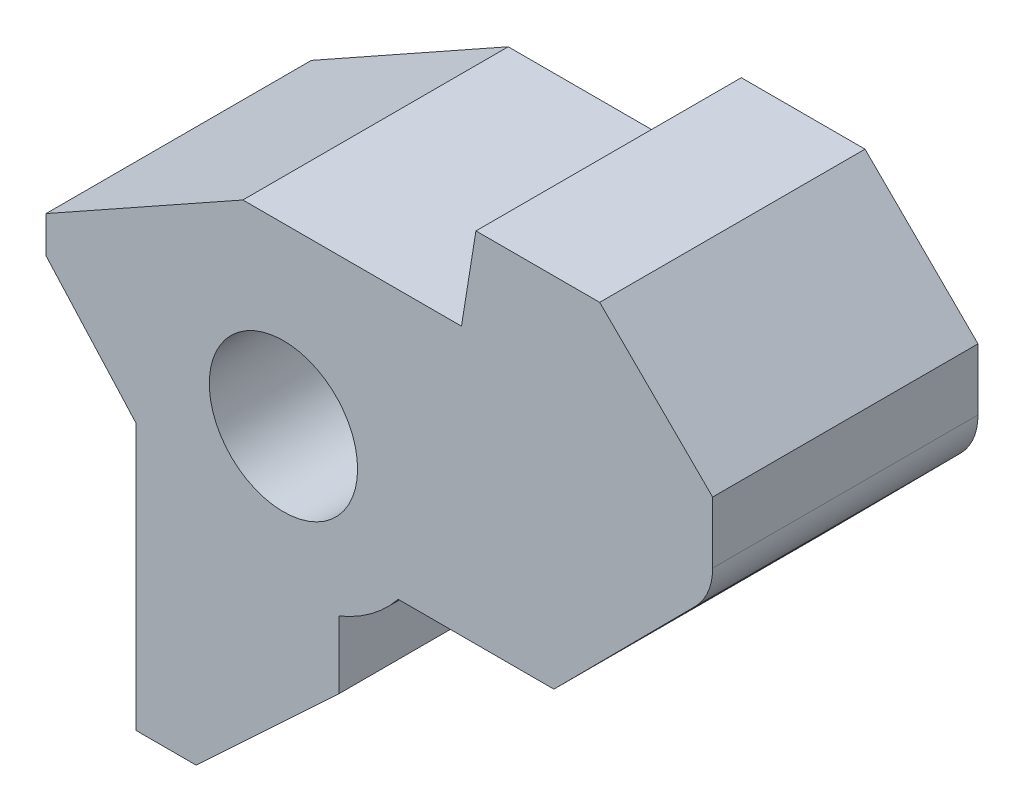
ISO-10303-21;
HEADER;
FILE_DESCRIPTION(('STEP AP214'),'2;1');
FILE_NAME('part.step','',(''),(''),'','','');
FILE_SCHEMA(('AUTOMOTIVE_DESIGN { 1 0 10303 214 1 1 1 1 }'));
ENDSEC;
DATA;
#1=APPLICATION_CONTEXT('core data for automotive mechanical design processes');
#2=APPLICATION_PROTOCOL_DEFINITION('international standard','automotive_design',2000,#1);
#3=PRODUCT_CONTEXT('',#1,'mechanical');
#4=PRODUCT('Part','Part','',(#3));
#5=PRODUCT_RELATED_PRODUCT_CATEGORY('part','',(#4));
#6=PRODUCT_DEFINITION_FORMATION('','',#4);
#7=PRODUCT_DEFINITION_CONTEXT('part definition',#1,'design');
#8=PRODUCT_DEFINITION('design','',#6,#7);
#9=PRODUCT_DEFINITION_SHAPE('','',#8);
#10=(LENGTH_UNIT() NAMED_UNIT(*) SI_UNIT(.MILLI.,.METRE.));
#11=(NAMED_UNIT(*) PLANE_ANGLE_UNIT() SI_UNIT($,.RADIAN.));
#12=(NAMED_UNIT(*) SI_UNIT($,.STERADIAN.) SOLID_ANGLE_UNIT());
#13=UNCERTAINTY_MEASURE_WITH_UNIT(LENGTH_MEASURE(1.E-05),#10,'distance_accuracy_value','');
#14=(GEOMETRIC_REPRESENTATION_CONTEXT(3) GLOBAL_UNCERTAINTY_ASSIGNED_CONTEXT((#13)) GLOBAL_UNIT_ASSIGNED_CONTEXT((#10,
#11,#12)) REPRESENTATION_CONTEXT('',''));
#15=CARTESIAN_POINT('',(0.,0.,0.));
#16=DIRECTION('',(0.,0.,1.));
#17=DIRECTION('',(1.,0.,0.));
#18=AXIS2_PLACEMENT_3D('',#15,#16,#17);
#19=CARTESIAN_POINT('',(1.87605445969652,0.,9.));
#20=DIRECTION('',(1.,0.,0.));
#21=DIRECTION('',(0.,1.,0.));
#22=AXIS2_PLACEMENT_3D('',#19,#20,#21);
#23=PLANE('',#22);
#24=DIRECTION('',(0.,-1.,0.));
#25=VECTOR('',#24,1.);
#26=CARTESIAN_POINT('',(1.87605445969652,0.,0.));
#27=LINE('',#26,#25);
#28=CARTESIAN_POINT('',(1.87605445969652,-4.63469736490451,0.));
#29=VERTEX_POINT('',#28);
#30=CARTESIAN_POINT('',(1.87605445969652,-6.92386785714255,0.));
#31=VERTEX_POINT('',#30);
#32=EDGE_CURVE('E150',#29,#31,#27,.T.);
#33=ORIENTED_EDGE('',*,*,#32,.F.);
#34=DIRECTION('',(0.,0.,-1.));
#35=VECTOR('',#34,1.);
#36=CARTESIAN_POINT('',(1.87605445969652,-4.63469736490451,9.));
#37=LINE('',#36,#35);
#38=CARTESIAN_POINT('',(1.87605445969652,-4.63469736490451,9.));
#39=VERTEX_POINT('',#38);
#40=EDGE_CURVE('E145',#39,#29,#37,.T.);
#41=ORIENTED_EDGE('',*,*,#40,.F.);
#42=DIRECTION('',(0.,-1.,0.));
#43=VECTOR('',#42,1.);
#44=CARTESIAN_POINT('',(1.87605445969652,0.,9.));
#45=LINE('',#44,#43);
#46=CARTESIAN_POINT('',(1.87605445969652,-6.92386785714255,9.));
#47=VERTEX_POINT('',#46);
#48=EDGE_CURVE('E148',#39,#47,#45,.T.);
#49=ORIENTED_EDGE('',*,*,#48,.T.);
#50=DIRECTION('',(0.,0.,-1.));
#51=VECTOR('',#50,1.);
#52=CARTESIAN_POINT('',(1.87605445969652,-6.92386785714255,9.));
#53=LINE('',#52,#51);
#54=EDGE_CURVE('E213',#47,#31,#53,.T.);
#55=ORIENTED_EDGE('',*,*,#54,.T.);
#56=EDGE_LOOP('',(#33,#41,#49,#55));
#57=FACE_BOUND('',#56,.T.);
#58=ADVANCED_FACE('F34',(#57),#23,.T.);
#59=CARTESIAN_POINT('',(0.,0.,9.));
#60=DIRECTION('',(0.,0.,-1.));
#61=DIRECTION('',(-1.,0.,0.));
#62=AXIS2_PLACEMENT_3D('',#59,#60,#61);
#63=CYLINDRICAL_SURFACE('',#62,5.);
#64=CARTESIAN_POINT('',(0.,0.,0.));
#65=DIRECTION('',(0.,0.,1.));
#66=DIRECTION('',(1.,0.,0.));
#67=AXIS2_PLACEMENT_3D('',#64,#65,#66);
#68=CIRCLE('',#67,5.);
#69=CARTESIAN_POINT('',(3.8931956076666,-3.13736003041498,0.));
#70=VERTEX_POINT('',#69);
#71=EDGE_CURVE('E215',#29,#70,#68,.T.);
#72=ORIENTED_EDGE('',*,*,#71,.T.);
#73=DIRECTION('',(0.,0.,-1.));
#74=VECTOR('',#73,1.);
#75=CARTESIAN_POINT('',(3.8931956076666,-3.13736003041498,9.));
#76=LINE('',#75,#74);
#77=CARTESIAN_POINT('',(3.8931956076666,-3.13736003041498,9.));
#78=VERTEX_POINT('',#77);
#79=EDGE_CURVE('E155',#78,#70,#76,.T.);
#80=ORIENTED_EDGE('',*,*,#79,.F.);
#81=CARTESIAN_POINT('',(0.,0.,9.));
#82=DIRECTION('',(0.,0.,1.));
#83=DIRECTION('',(1.,0.,0.));
#84=AXIS2_PLACEMENT_3D('',#81,#82,#83);
#85=CIRCLE('',#84,5.);
#86=EDGE_CURVE('E158',#39,#78,#85,.T.);
#87=ORIENTED_EDGE('',*,*,#86,.F.);
#88=ORIENTED_EDGE('',*,*,#40,.T.);
#89=EDGE_LOOP('',(#72,#80,#87,#88));
#90=FACE_BOUND('',#89,.T.);
#91=ADVANCED_FACE('F159',(#90),#63,.T.);
#92=CARTESIAN_POINT('',(0.,-3.13736003041498,9.));
#93=DIRECTION('',(0.,-1.,0.));
#94=DIRECTION('',(1.,0.,0.));
#95=AXIS2_PLACEMENT_3D('',#92,#93,#94);
#96=PLANE('',#95);
#97=DIRECTION('',(-1.,0.,0.));
#98=VECTOR('',#97,1.);
#99=CARTESIAN_POINT('',(0.,-3.13736003041498,0.));
#100=LINE('',#99,#98);
#101=CARTESIAN_POINT('',(9.17297865889068,-3.13736003041498,0.));
#102=VERTEX_POINT('',#101);
#103=EDGE_CURVE('E217',#102,#70,#100,.T.);
#104=ORIENTED_EDGE('',*,*,#103,.F.);
#105=DIRECTION('',(0.,0.,-1.));
#106=VECTOR('',#105,1.);
#107=CARTESIAN_POINT('',(9.17297865889068,-3.13736003041498,9.));
#108=LINE('',#107,#106);
#109=CARTESIAN_POINT('',(9.17297865889068,-3.13736003041498,9.));
#110=VERTEX_POINT('',#109);
#111=EDGE_CURVE('E274',#110,#102,#108,.T.);
#112=ORIENTED_EDGE('',*,*,#111,.F.);
#113=DIRECTION('',(-1.,0.,0.));
#114=VECTOR('',#113,1.);
#115=CARTESIAN_POINT('',(0.,-3.13736003041498,9.));
#116=LINE('',#115,#114);
#117=EDGE_CURVE('E163',#110,#78,#116,.T.);
#118=ORIENTED_EDGE('',*,*,#117,.T.);
#119=ORIENTED_EDGE('',*,*,#79,.T.);
#120=EDGE_LOOP('',(#104,#112,#118,#119));
#121=FACE_BOUND('',#120,.T.);
#122=ADVANCED_FACE('F304',(#121),#96,.T.);
#123=CARTESIAN_POINT('',(6.18871742745594,-6.14355777107952,9.));
#124=DIRECTION('',(0.709691382805682,-0.704512697665102,0.));
#125=DIRECTION('',(0.704512697665102,0.709691382805682,0.));
#126=AXIS2_PLACEMENT_3D('',#123,#124,#125);
#127=PLANE('',#126);
#128=DIRECTION('',(-0.704512697665102,-0.709691382805682,0.));
#129=VECTOR('',#128,1.);
#130=CARTESIAN_POINT('',(6.18871742745594,-6.14355777107952,0.));
#131=LINE('',#130,#129);
#132=CARTESIAN_POINT('',(13.9764570076674,1.70142740793573,0.));
#133=VERTEX_POINT('',#132);
#134=EDGE_CURVE('E220',#133,#102,#131,.T.);
#135=ORIENTED_EDGE('',*,*,#134,.F.);
#136=DIRECTION('',(0.,0.,-1.));
#137=VECTOR('',#136,1.);
#138=CARTESIAN_POINT('',(13.9764570076674,1.70142740793573,9.));
#139=LINE('',#138,#137);
#140=CARTESIAN_POINT('',(13.9764570076674,1.70142740793573,9.));
#141=VERTEX_POINT('',#140);
#142=EDGE_CURVE('E42',#133,#141,#139,.F.);
#143=ORIENTED_EDGE('',*,*,#142,.T.);
#144=DIRECTION('',(-0.704512697665102,-0.709691382805682,0.));
#145=VECTOR('',#144,1.);
#146=CARTESIAN_POINT('',(6.18871742745594,-6.14355777107952,9.));
#147=LINE('',#146,#145);
#148=EDGE_CURVE('E178',#141,#110,#147,.T.);
#149=ORIENTED_EDGE('',*,*,#148,.T.);
#150=ORIENTED_EDGE('',*,*,#111,.T.);
#151=EDGE_LOOP('',(#135,#143,#149,#150));
#152=FACE_BOUND('',#151,.T.);
#153=ADVANCED_FACE('F309',(#152),#127,.T.);
#154=CARTESIAN_POINT('',(14.557074242056,0.,9.));
#155=DIRECTION('',(1.,0.,0.));
#156=DIRECTION('',(0.,0.,-1.));
#157=AXIS2_PLACEMENT_3D('',#154,#155,#156);
#158=PLANE('',#157);
#159=DIRECTION('',(0.,-1.,0.));
#160=VECTOR('',#159,1.);
#161=CARTESIAN_POINT('',(14.557074242056,0.,9.));
#162=LINE('',#161,#160);
#163=CARTESIAN_POINT('',(14.557074242056,5.19802237614641,9.));
#164=VERTEX_POINT('',#163);
#165=CARTESIAN_POINT('',(14.557074242056,3.11045280326593,9.));
#166=VERTEX_POINT('',#165);
#167=EDGE_CURVE('E180',#164,#166,#162,.T.);
#168=ORIENTED_EDGE('',*,*,#167,.T.);
#169=DIRECTION('',(0.,0.,-1.));
#170=VECTOR('',#169,1.);
#171=CARTESIAN_POINT('',(14.557074242056,3.11045280326593,9.));
#172=LINE('',#171,#170);
#173=CARTESIAN_POINT('',(14.557074242056,3.11045280326593,0.));
#174=VERTEX_POINT('',#173);
#175=EDGE_CURVE('E154',#166,#174,#172,.T.);
#176=ORIENTED_EDGE('',*,*,#175,.T.);
#177=DIRECTION('',(0.,-1.,0.));
#178=VECTOR('',#177,1.);
#179=CARTESIAN_POINT('',(14.557074242056,0.,0.));
#180=LINE('',#179,#178);
#181=CARTESIAN_POINT('',(14.557074242056,5.19802237614641,0.));
#182=VERTEX_POINT('',#181);
#183=EDGE_CURVE('E222',#182,#174,#180,.T.);
#184=ORIENTED_EDGE('',*,*,#183,.F.);
#185=DIRECTION('',(0.,0.,-1.));
#186=VECTOR('',#185,1.);
#187=CARTESIAN_POINT('',(14.557074242056,5.19802237614641,9.));
#188=LINE('',#187,#186);
#189=EDGE_CURVE('E272',#164,#182,#188,.T.);
#190=ORIENTED_EDGE('',*,*,#189,.F.);
#191=EDGE_LOOP('',(#168,#176,#184,#190));
#192=FACE_BOUND('',#191,.T.);
#193=ADVANCED_FACE('F283',(#192),#158,.T.);
#194=CARTESIAN_POINT('',(9.82417265596004,9.89638753174656,9.));
#195=DIRECTION('',(0.704512697665102,0.709691382805682,0.));
#196=DIRECTION('',(-0.709691382805682,0.704512697665102,0.));
#197=AXIS2_PLACEMENT_3D('',#194,#195,#196);
#198=PLANE('',#197);
#199=DIRECTION('',(0.709691382805682,-0.704512697665102,0.));
#200=VECTOR('',#199,1.);
#201=CARTESIAN_POINT('',(9.82417265596004,9.89638753174656,0.));
#202=LINE('',#201,#200);
#203=CARTESIAN_POINT('',(10.7256498043451,9.00148854737192,0.));
#204=VERTEX_POINT('',#203);
#205=EDGE_CURVE('E224',#204,#182,#202,.T.);
#206=ORIENTED_EDGE('',*,*,#205,.F.);
#207=DIRECTION('',(0.,0.,-1.));
#208=VECTOR('',#207,1.);
#209=CARTESIAN_POINT('',(10.7256498043451,9.00148854737192,9.));
#210=LINE('',#209,#208);
#211=CARTESIAN_POINT('',(10.7256498043451,9.00148854737192,9.));
#212=VERTEX_POINT('',#211);
#213=EDGE_CURVE('E270',#212,#204,#210,.T.);
#214=ORIENTED_EDGE('',*,*,#213,.F.);
#215=DIRECTION('',(0.709691382805682,-0.704512697665102,0.));
#216=VECTOR('',#215,1.);
#217=CARTESIAN_POINT('',(9.82417265596004,9.89638753174656,9.));
#218=LINE('',#217,#216);
#219=EDGE_CURVE('E183',#212,#164,#218,.T.);
#220=ORIENTED_EDGE('',*,*,#219,.T.);
#221=ORIENTED_EDGE('',*,*,#189,.T.);
#222=EDGE_LOOP('',(#206,#214,#220,#221));
#223=FACE_BOUND('',#222,.T.);
#224=ADVANCED_FACE('F292',(#223),#198,.T.);
#225=CARTESIAN_POINT('',(0.,9.00148854737192,9.));
#226=DIRECTION('',(0.,1.,0.));
#227=DIRECTION('',(0.,0.,1.));
#228=AXIS2_PLACEMENT_3D('',#225,#226,#227);
#229=PLANE('',#228);
#230=DIRECTION('',(1.,0.,0.));
#231=VECTOR('',#230,1.);
#232=CARTESIAN_POINT('',(0.,9.00148854737192,0.));
#233=LINE('',#232,#231);
#234=CARTESIAN_POINT('',(6.5285930170798,9.00148854737192,0.));
#235=VERTEX_POINT('',#234);
#236=EDGE_CURVE('E227',#235,#204,#233,.T.);
#237=ORIENTED_EDGE('',*,*,#236,.F.);
#238=DIRECTION('',(0.,0.,-1.));
#239=VECTOR('',#238,1.);
#240=CARTESIAN_POINT('',(6.5285930170798,9.00148854737192,9.));
#241=LINE('',#240,#239);
#242=CARTESIAN_POINT('',(6.5285930170798,9.00148854737192,9.));
#243=VERTEX_POINT('',#242);
#244=EDGE_CURVE('E268',#243,#235,#241,.T.);
#245=ORIENTED_EDGE('',*,*,#244,.F.);
#246=DIRECTION('',(1.,0.,0.));
#247=VECTOR('',#246,1.);
#248=CARTESIAN_POINT('',(0.,9.00148854737192,9.));
#249=LINE('',#248,#247);
#250=EDGE_CURVE('E186',#243,#212,#249,.T.);
#251=ORIENTED_EDGE('',*,*,#250,.T.);
#252=ORIENTED_EDGE('',*,*,#213,.T.);
#253=EDGE_LOOP('',(#237,#245,#251,#252));
#254=FACE_BOUND('',#253,.T.);
#255=ADVANCED_FACE('F317',(#254),#229,.T.);
#256=CARTESIAN_POINT('',(4.94893615583577,-0.797776271857066,9.));
#257=DIRECTION('',(-0.987254891374429,0.159147037224273,0.));
#258=DIRECTION('',(-0.159147037224273,-0.987254891374429,0.));
#259=AXIS2_PLACEMENT_3D('',#256,#257,#258);
#260=PLANE('',#259);
#261=DIRECTION('',(0.159147037224273,0.987254891374429,0.));
#262=VECTOR('',#261,1.);
#263=CARTESIAN_POINT('',(4.94893615583577,-0.797776271857066,0.));
#264=LINE('',#263,#262);
#265=CARTESIAN_POINT('',(6.03788217845628,5.95740626892641,0.));
#266=VERTEX_POINT('',#265);
#267=EDGE_CURVE('E230',#266,#235,#264,.T.);
#268=ORIENTED_EDGE('',*,*,#267,.F.);
#269=DIRECTION('',(0.,0.,-1.));
#270=VECTOR('',#269,1.);
#271=CARTESIAN_POINT('',(6.03788217845628,5.95740626892641,9.));
#272=LINE('',#271,#270);
#273=CARTESIAN_POINT('',(6.03788217845628,5.95740626892641,9.));
#274=VERTEX_POINT('',#273);
#275=EDGE_CURVE('E266',#274,#266,#272,.T.);
#276=ORIENTED_EDGE('',*,*,#275,.F.);
#277=DIRECTION('',(0.159147037224273,0.987254891374429,0.));
#278=VECTOR('',#277,1.);
#279=CARTESIAN_POINT('',(4.94893615583577,-0.797776271857066,9.));
#280=LINE('',#279,#278);
#281=EDGE_CURVE('E189',#274,#243,#280,.T.);
#282=ORIENTED_EDGE('',*,*,#281,.T.);
#283=ORIENTED_EDGE('',*,*,#244,.T.);
#284=EDGE_LOOP('',(#268,#276,#282,#283));
#285=FACE_BOUND('',#284,.T.);
#286=ADVANCED_FACE('F320',(#285),#260,.T.);
#287=CARTESIAN_POINT('',(0.,5.95740626892641,9.));
#288=DIRECTION('',(0.,-1.,0.));
#289=DIRECTION('',(1.,0.,0.));
#290=AXIS2_PLACEMENT_3D('',#287,#288,#289);
#291=PLANE('',#290);
#292=DIRECTION('',(-1.,0.,0.));
#293=VECTOR('',#292,1.);
#294=CARTESIAN_POINT('',(0.,5.95740626892641,0.));
#295=LINE('',#294,#293);
#296=CARTESIAN_POINT('',(-1.37635566788677,5.95740626892641,0.));
#297=VERTEX_POINT('',#296);
#298=EDGE_CURVE('E233',#266,#297,#295,.T.);
#299=ORIENTED_EDGE('',*,*,#298,.T.);
#300=DIRECTION('',(0.,0.,-1.));
#301=VECTOR('',#300,1.);
#302=CARTESIAN_POINT('',(-1.37635566788677,5.95740626892641,9.));
#303=LINE('',#302,#301);
#304=CARTESIAN_POINT('',(-1.37635566788677,5.95740626892641,9.));
#305=VERTEX_POINT('',#304);
#306=EDGE_CURVE('E264',#305,#297,#303,.T.);
#307=ORIENTED_EDGE('',*,*,#306,.F.);
#308=DIRECTION('',(-1.,0.,0.));
#309=VECTOR('',#308,1.);
#310=CARTESIAN_POINT('',(0.,5.95740626892641,9.));
#311=LINE('',#310,#309);
#312=EDGE_CURVE('E192',#274,#305,#311,.T.);
#313=ORIENTED_EDGE('',*,*,#312,.F.);
#314=ORIENTED_EDGE('',*,*,#275,.T.);
#315=EDGE_LOOP('',(#299,#307,#313,#314));
#316=FACE_BOUND('',#315,.T.);
#317=ADVANCED_FACE('F324',(#316),#291,.F.);
#318=CARTESIAN_POINT('',(-2.8678772487103,5.12233826098467,9.));
#319=DIRECTION('',(-0.488521388480712,0.872551919943379,0.));
#320=DIRECTION('',(-0.872551919943379,-0.488521388480713,0.));
#321=AXIS2_PLACEMENT_3D('',#318,#319,#320);
#322=PLANE('',#321);
#323=DIRECTION('',(0.872551919943379,0.488521388480713,0.));
#324=VECTOR('',#323,1.);
#325=CARTESIAN_POINT('',(-2.8678772487103,5.12233826098467,0.));
#326=LINE('',#325,#324);
#327=CARTESIAN_POINT('',(-8.05314300071572,2.21922938354898,0.));
#328=VERTEX_POINT('',#327);
#329=EDGE_CURVE('E236',#328,#297,#326,.T.);
#330=ORIENTED_EDGE('',*,*,#329,.F.);
#331=DIRECTION('',(0.,0.,-1.));
#332=VECTOR('',#331,1.);
#333=CARTESIAN_POINT('',(-8.05314300071572,2.21922938354898,9.));
#334=LINE('',#333,#332);
#335=CARTESIAN_POINT('',(-8.05314300071572,2.21922938354898,9.));
#336=VERTEX_POINT('',#335);
#337=EDGE_CURVE('E262',#336,#328,#334,.T.);
#338=ORIENTED_EDGE('',*,*,#337,.F.);
#339=DIRECTION('',(0.872551919943379,0.488521388480713,0.));
#340=VECTOR('',#339,1.);
#341=CARTESIAN_POINT('',(-2.8678772487103,5.12233826098467,9.));
#342=LINE('',#341,#340);
#343=EDGE_CURVE('E194',#336,#305,#342,.T.);
#344=ORIENTED_EDGE('',*,*,#343,.T.);
#345=ORIENTED_EDGE('',*,*,#306,.T.);
#346=EDGE_LOOP('',(#330,#338,#344,#345));
#347=FACE_BOUND('',#346,.T.);
#348=ADVANCED_FACE('F328',(#347),#322,.T.);
#349=CARTESIAN_POINT('',(-8.05314300071572,0.,9.));
#350=DIRECTION('',(-1.,0.,0.));
#351=DIRECTION('',(0.,0.,1.));
#352=AXIS2_PLACEMENT_3D('',#349,#350,#351);
#353=PLANE('',#352);
#354=DIRECTION('',(0.,1.,0.));
#355=VECTOR('',#354,1.);
#356=CARTESIAN_POINT('',(-8.05314300071572,0.,0.));
#357=LINE('',#356,#355);
#358=CARTESIAN_POINT('',(-8.05314300071572,0.978578294747309,0.));
#359=VERTEX_POINT('',#358);
#360=EDGE_CURVE('E239',#359,#328,#357,.T.);
#361=ORIENTED_EDGE('',*,*,#360,.F.);
#362=DIRECTION('',(0.,0.,-1.));
#363=VECTOR('',#362,1.);
#364=CARTESIAN_POINT('',(-8.05314300071572,0.978578294747309,9.));
#365=LINE('',#364,#363);
#366=CARTESIAN_POINT('',(-8.05314300071572,0.978578294747309,9.));
#367=VERTEX_POINT('',#366);
#368=EDGE_CURVE('E260',#367,#359,#365,.T.);
#369=ORIENTED_EDGE('',*,*,#368,.F.);
#370=DIRECTION('',(0.,1.,0.));
#371=VECTOR('',#370,1.);
#372=CARTESIAN_POINT('',(-8.05314300071572,0.,9.));
#373=LINE('',#372,#371);
#374=EDGE_CURVE('E197',#367,#336,#373,.T.);
#375=ORIENTED_EDGE('',*,*,#374,.T.);
#376=ORIENTED_EDGE('',*,*,#337,.T.);
#377=EDGE_LOOP('',(#361,#369,#375,#376));
#378=FACE_BOUND('',#377,.T.);
#379=ADVANCED_FACE('F332',(#378),#353,.T.);
#380=CARTESIAN_POINT('',(-3.95697377108317,-3.5663042831013,9.));
#381=DIRECTION('',(-0.742824639331619,-0.66948603809329,0.));
#382=DIRECTION('',(0.66948603809329,-0.742824639331619,0.));
#383=AXIS2_PLACEMENT_3D('',#380,#381,#382);
#384=PLANE('',#383);
#385=DIRECTION('',(-0.66948603809329,0.742824639331619,0.));
#386=VECTOR('',#385,1.);
#387=CARTESIAN_POINT('',(-3.95697377108317,-3.5663042831013,0.));
#388=LINE('',#387,#386);
#389=CARTESIAN_POINT('',(-5.,-2.40902013044717,0.));
#390=VERTEX_POINT('',#389);
#391=EDGE_CURVE('E242',#390,#359,#388,.T.);
#392=ORIENTED_EDGE('',*,*,#391,.F.);
#393=DIRECTION('',(0.,0.,-1.));
#394=VECTOR('',#393,1.);
#395=CARTESIAN_POINT('',(-5.,-2.40902013044717,9.));
#396=LINE('',#395,#394);
#397=CARTESIAN_POINT('',(-5.,-2.40902013044717,9.));
#398=VERTEX_POINT('',#397);
#399=EDGE_CURVE('E258',#398,#390,#396,.T.);
#400=ORIENTED_EDGE('',*,*,#399,.F.);
#401=DIRECTION('',(-0.66948603809329,0.742824639331619,0.));
#402=VECTOR('',#401,1.);
#403=CARTESIAN_POINT('',(-3.95697377108317,-3.5663042831013,9.));
#404=LINE('',#403,#402);
#405=EDGE_CURVE('E200',#398,#367,#404,.T.);
#406=ORIENTED_EDGE('',*,*,#405,.T.);
#407=ORIENTED_EDGE('',*,*,#368,.T.);
#408=EDGE_LOOP('',(#392,#400,#406,#407));
#409=FACE_BOUND('',#408,.T.);
#410=ADVANCED_FACE('F336',(#409),#384,.T.);
#411=CARTESIAN_POINT('',(-5.,0.,9.));
#412=DIRECTION('',(-1.,0.,0.));
#413=DIRECTION('',(0.,0.,1.));
#414=AXIS2_PLACEMENT_3D('',#411,#412,#413);
#415=PLANE('',#414);
#416=DIRECTION('',(0.,1.,0.));
#417=VECTOR('',#416,1.);
#418=CARTESIAN_POINT('',(-5.,0.,0.));
#419=LINE('',#418,#417);
#420=CARTESIAN_POINT('',(-5.,-11.436332263735,0.));
#421=VERTEX_POINT('',#420);
#422=EDGE_CURVE('E245',#421,#390,#419,.T.);
#423=ORIENTED_EDGE('',*,*,#422,.F.);
#424=DIRECTION('',(0.,0.,-1.));
#425=VECTOR('',#424,1.);
#426=CARTESIAN_POINT('',(-5.,-11.436332263735,9.));
#427=LINE('',#426,#425);
#428=CARTESIAN_POINT('',(-5.,-11.436332263735,9.));
#429=VERTEX_POINT('',#428);
#430=EDGE_CURVE('E256',#429,#421,#427,.T.);
#431=ORIENTED_EDGE('',*,*,#430,.F.);
#432=DIRECTION('',(0.,1.,0.));
#433=VECTOR('',#432,1.);
#434=CARTESIAN_POINT('',(-5.,0.,9.));
#435=LINE('',#434,#433);
#436=EDGE_CURVE('E203',#429,#398,#435,.T.);
#437=ORIENTED_EDGE('',*,*,#436,.T.);
#438=ORIENTED_EDGE('',*,*,#399,.T.);
#439=EDGE_LOOP('',(#423,#431,#437,#438));
#440=FACE_BOUND('',#439,.T.);
#441=ADVANCED_FACE('F340',(#440),#415,.T.);
#442=CARTESIAN_POINT('',(0.,-11.436332263735,9.));
#443=DIRECTION('',(0.,-1.,0.));
#444=DIRECTION('',(0.,0.,-1.));
#445=AXIS2_PLACEMENT_3D('',#442,#443,#444);
#446=PLANE('',#445);
#447=DIRECTION('',(-1.,0.,0.));
#448=VECTOR('',#447,1.);
#449=CARTESIAN_POINT('',(0.,-11.436332263735,0.));
#450=LINE('',#449,#448);
#451=CARTESIAN_POINT('',(-2.95681906505285,-11.436332263735,0.));
#452=VERTEX_POINT('',#451);
#453=EDGE_CURVE('E248',#452,#421,#450,.T.);
#454=ORIENTED_EDGE('',*,*,#453,.F.);
#455=DIRECTION('',(0.,0.,-1.));
#456=VECTOR('',#455,1.);
#457=CARTESIAN_POINT('',(-2.95681906505285,-11.436332263735,9.));
#458=LINE('',#457,#456);
#459=CARTESIAN_POINT('',(-2.95681906505285,-11.436332263735,9.));
#460=VERTEX_POINT('',#459);
#461=EDGE_CURVE('E254',#460,#452,#458,.T.);
#462=ORIENTED_EDGE('',*,*,#461,.F.);
#463=DIRECTION('',(-1.,0.,0.));
#464=VECTOR('',#463,1.);
#465=CARTESIAN_POINT('',(0.,-11.436332263735,9.));
#466=LINE('',#465,#464);
#467=EDGE_CURVE('E206',#460,#429,#466,.T.);
#468=ORIENTED_EDGE('',*,*,#467,.T.);
#469=ORIENTED_EDGE('',*,*,#430,.T.);
#470=EDGE_LOOP('',(#454,#462,#468,#469));
#471=FACE_BOUND('',#470,.T.);
#472=ADVANCED_FACE('F344',(#471),#446,.T.);
#473=CARTESIAN_POINT('',(4.3275859112869,-4.63486766702953,9.));
#474=DIRECTION('',(-0.682462310143159,0.730920785881796,0.));
#475=DIRECTION('',(-0.730920785881796,-0.682462310143159,0.));
#476=AXIS2_PLACEMENT_3D('',#473,#474,#475);
#477=PLANE('',#476);
#478=DIRECTION('',(0.730920785881796,0.682462310143159,0.));
#479=VECTOR('',#478,1.);
#480=CARTESIAN_POINT('',(4.3275859112869,-4.63486766702953,0.));
#481=LINE('',#480,#479);
#482=EDGE_CURVE('E174',#452,#31,#481,.T.);
#483=ORIENTED_EDGE('',*,*,#482,.T.);
#484=ORIENTED_EDGE('',*,*,#54,.F.);
#485=DIRECTION('',(0.730920785881796,0.682462310143159,0.));
#486=VECTOR('',#485,1.);
#487=CARTESIAN_POINT('',(4.3275859112869,-4.63486766702953,9.));
#488=LINE('',#487,#486);
#489=EDGE_CURVE('E169',#460,#47,#488,.T.);
#490=ORIENTED_EDGE('',*,*,#489,.F.);
#491=ORIENTED_EDGE('',*,*,#461,.T.);
#492=EDGE_LOOP('',(#483,#484,#490,#491));
#493=FACE_BOUND('',#492,.T.);
#494=ADVANCED_FACE('F348',(#493),#477,.F.);
#495=CARTESIAN_POINT('',(0.,0.,9.));
#496=DIRECTION('',(0.,0.,-1.));
#497=DIRECTION('',(-1.,0.,0.));
#498=AXIS2_PLACEMENT_3D('',#495,#496,#497);
#499=CYLINDRICAL_SURFACE('',#498,2.515);
#500=CARTESIAN_POINT('',(0.,0.,9.));
#501=DIRECTION('',(0.,0.,1.));
#502=DIRECTION('',(1.,0.,0.));
#503=AXIS2_PLACEMENT_3D('',#500,#501,#502);
#504=CIRCLE('',#503,2.515);
#505=CARTESIAN_POINT('',(2.515,0.,9.));
#506=VERTEX_POINT('',#505);
#507=EDGE_CURVE('E210',#506,#506,#504,.T.);
#508=ORIENTED_EDGE('',*,*,#507,.T.);
#509=EDGE_LOOP('',(#508));
#510=FACE_BOUND('',#509,.T.);
#511=CARTESIAN_POINT('',(0.,0.,0.));
#512=DIRECTION('',(0.,0.,1.));
#513=DIRECTION('',(1.,0.,0.));
#514=AXIS2_PLACEMENT_3D('',#511,#512,#513);
#515=CIRCLE('',#514,2.515);
#516=CARTESIAN_POINT('',(2.515,0.,0.));
#517=VERTEX_POINT('',#516);
#518=EDGE_CURVE('E171',#517,#517,#515,.T.);
#519=ORIENTED_EDGE('',*,*,#518,.F.);
#520=EDGE_LOOP('',(#519));
#521=FACE_BOUND('',#520,.T.);
#522=ADVANCED_FACE('F352',(#510,#521),#499,.F.);
#523=CARTESIAN_POINT('',(0.,0.,9.));
#524=DIRECTION('',(0.,0.,1.));
#525=DIRECTION('',(1.,0.,0.));
#526=AXIS2_PLACEMENT_3D('',#523,#524,#525);
#527=PLANE('',#526);
#528=ORIENTED_EDGE('',*,*,#148,.F.);
#529=CARTESIAN_POINT('',(12.557074242056,3.11045280326593,9.));
#530=DIRECTION('',(0.,0.,1.));
#531=DIRECTION('',(1.,0.,0.));
#532=AXIS2_PLACEMENT_3D('',#529,#530,#531);
#533=CIRCLE('',#532,2.);
#534=EDGE_CURVE('E11',#141,#166,#533,.T.);
#535=ORIENTED_EDGE('',*,*,#534,.T.);
#536=ORIENTED_EDGE('',*,*,#167,.F.);
#537=ORIENTED_EDGE('',*,*,#219,.F.);
#538=ORIENTED_EDGE('',*,*,#250,.F.);
#539=ORIENTED_EDGE('',*,*,#281,.F.);
#540=ORIENTED_EDGE('',*,*,#312,.T.);
#541=ORIENTED_EDGE('',*,*,#343,.F.);
#542=ORIENTED_EDGE('',*,*,#374,.F.);
#543=ORIENTED_EDGE('',*,*,#405,.F.);
#544=ORIENTED_EDGE('',*,*,#436,.F.);
#545=ORIENTED_EDGE('',*,*,#467,.F.);
#546=ORIENTED_EDGE('',*,*,#489,.T.);
#547=ORIENTED_EDGE('',*,*,#48,.F.);
#548=ORIENTED_EDGE('',*,*,#86,.T.);
#549=ORIENTED_EDGE('',*,*,#117,.F.);
#550=EDGE_LOOP('',(#528,#535,#536,#537,#538,#539,#540,#541,#542,#543,#544,#545,#546,#547,#548,#549));
#551=FACE_BOUND('',#550,.T.);
#552=ORIENTED_EDGE('',*,*,#507,.F.);
#553=EDGE_LOOP('',(#552));
#554=FACE_BOUND('',#553,.T.);
#555=ADVANCED_FACE('F165',(#551,#554),#527,.T.);
#556=CARTESIAN_POINT('',(0.,0.,0.));
#557=DIRECTION('',(0.,0.,1.));
#558=DIRECTION('',(1.,0.,0.));
#559=AXIS2_PLACEMENT_3D('',#556,#557,#558);
#560=PLANE('',#559);
#561=ORIENTED_EDGE('',*,*,#183,.T.);
#562=CARTESIAN_POINT('',(12.557074242056,3.11045280326593,0.));
#563=DIRECTION('',(0.,0.,1.));
#564=DIRECTION('',(1.,0.,0.));
#565=AXIS2_PLACEMENT_3D('',#562,#563,#564);
#566=CIRCLE('',#565,2.);
#567=EDGE_CURVE('E56',#174,#133,#566,.F.);
#568=ORIENTED_EDGE('',*,*,#567,.T.);
#569=ORIENTED_EDGE('',*,*,#134,.T.);
#570=ORIENTED_EDGE('',*,*,#103,.T.);
#571=ORIENTED_EDGE('',*,*,#71,.F.);
#572=ORIENTED_EDGE('',*,*,#32,.T.);
#573=ORIENTED_EDGE('',*,*,#482,.F.);
#574=ORIENTED_EDGE('',*,*,#453,.T.);
#575=ORIENTED_EDGE('',*,*,#422,.T.);
#576=ORIENTED_EDGE('',*,*,#391,.T.);
#577=ORIENTED_EDGE('',*,*,#360,.T.);
#578=ORIENTED_EDGE('',*,*,#329,.T.);
#579=ORIENTED_EDGE('',*,*,#298,.F.);
#580=ORIENTED_EDGE('',*,*,#267,.T.);
#581=ORIENTED_EDGE('',*,*,#236,.T.);
#582=ORIENTED_EDGE('',*,*,#205,.T.);
#583=EDGE_LOOP('',(#561,#568,#569,#570,#571,#572,#573,#574,#575,#576,#577,#578,#579,#580,#581,#582));
#584=FACE_BOUND('',#583,.T.);
#585=ORIENTED_EDGE('',*,*,#518,.T.);
#586=EDGE_LOOP('',(#585));
#587=FACE_BOUND('',#586,.T.);
#588=ADVANCED_FACE('F287',(#584,#587),#560,.F.);
#589=CARTESIAN_POINT('',(12.557074242056,3.11045280326593,9.));
#590=DIRECTION('',(0.,0.,-1.));
#591=DIRECTION('',(-1.,0.,0.));
#592=AXIS2_PLACEMENT_3D('',#589,#590,#591);
#593=CYLINDRICAL_SURFACE('',#592,2.);
#594=ORIENTED_EDGE('',*,*,#534,.F.);
#595=ORIENTED_EDGE('',*,*,#142,.F.);
#596=ORIENTED_EDGE('',*,*,#567,.F.);
#597=ORIENTED_EDGE('',*,*,#175,.F.);
#598=EDGE_LOOP('',(#594,#595,#596,#597));
#599=FACE_BOUND('',#598,.T.);
#600=ADVANCED_FACE('F36',(#599),#593,.T.);
#601=CLOSED_SHELL('',(#58,#91,#122,#153,#193,#224,#255,#286,#317,#348,#379,#410,#441,#472,#494,
#522,#555,#588,#600));
#602=MANIFOLD_SOLID_BREP('B2',#601);
#603=ADVANCED_BREP_SHAPE_REPRESENTATION('',(#18,#602),#14);
#604=SHAPE_DEFINITION_REPRESENTATION(#9,#603);
ENDSEC;
END-ISO-10303-21;
